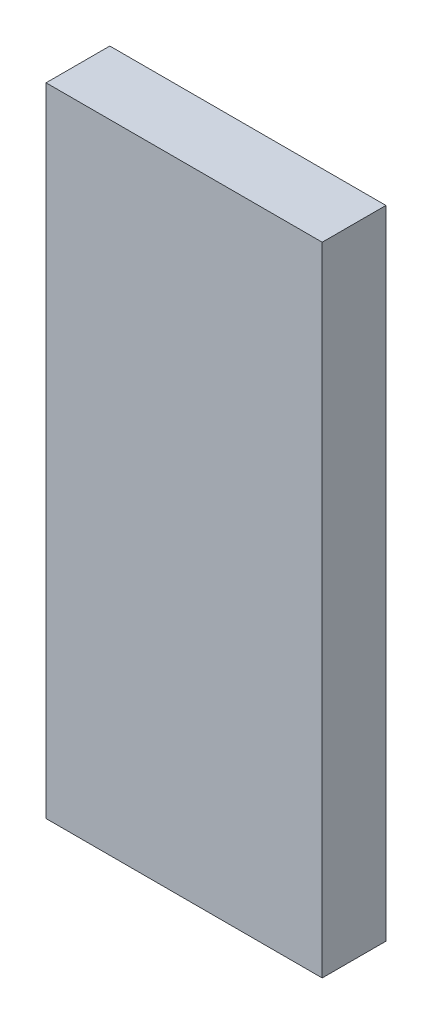
ISO-10303-21;
HEADER;
FILE_DESCRIPTION(('STEP AP214'),'2;1');
FILE_NAME('part.step','',(''),(''),'','','');
FILE_SCHEMA(('AUTOMOTIVE_DESIGN { 1 0 10303 214 1 1 1 1 }'));
ENDSEC;
DATA;
#1=APPLICATION_CONTEXT('core data for automotive mechanical design processes');
#2=APPLICATION_PROTOCOL_DEFINITION('international standard','automotive_design',2000,#1);
#3=PRODUCT_CONTEXT('',#1,'mechanical');
#4=PRODUCT('Part','Part','',(#3));
#5=PRODUCT_RELATED_PRODUCT_CATEGORY('part','',(#4));
#6=PRODUCT_DEFINITION_FORMATION('','',#4);
#7=PRODUCT_DEFINITION_CONTEXT('part definition',#1,'design');
#8=PRODUCT_DEFINITION('design','',#6,#7);
#9=PRODUCT_DEFINITION_SHAPE('','',#8);
#10=(LENGTH_UNIT() NAMED_UNIT(*) SI_UNIT(.MILLI.,.METRE.));
#11=(NAMED_UNIT(*) PLANE_ANGLE_UNIT() SI_UNIT($,.RADIAN.));
#12=(NAMED_UNIT(*) SI_UNIT($,.STERADIAN.) SOLID_ANGLE_UNIT());
#13=UNCERTAINTY_MEASURE_WITH_UNIT(LENGTH_MEASURE(1.E-05),#10,'distance_accuracy_value','');
#14=(GEOMETRIC_REPRESENTATION_CONTEXT(3) GLOBAL_UNCERTAINTY_ASSIGNED_CONTEXT((#13)) GLOBAL_UNIT_ASSIGNED_CONTEXT((#10,
#11,#12)) REPRESENTATION_CONTEXT('',''));
#15=CARTESIAN_POINT('',(0.,0.,0.));
#16=DIRECTION('',(0.,0.,1.));
#17=DIRECTION('',(1.,0.,0.));
#18=AXIS2_PLACEMENT_3D('',#15,#16,#17);
#19=CARTESIAN_POINT('',(0.,0.,0.));
#20=DIRECTION('',(0.,0.,1.));
#21=DIRECTION('',(1.,0.,0.));
#22=AXIS2_PLACEMENT_3D('',#19,#20,#21);
#23=PLANE('',#22);
#24=DIRECTION('',(0.,1.,0.));
#25=VECTOR('',#24,1.);
#26=CARTESIAN_POINT('',(-5.5,0.,0.));
#27=LINE('',#26,#25);
#28=CARTESIAN_POINT('',(-5.5,-14.,0.));
#29=VERTEX_POINT('',#28);
#30=CARTESIAN_POINT('',(-5.5,14.,0.));
#31=VERTEX_POINT('',#30);
#32=EDGE_CURVE('E125',#29,#31,#27,.T.);
#33=ORIENTED_EDGE('',*,*,#32,.T.);
#34=DIRECTION('',(1.,0.,0.));
#35=VECTOR('',#34,1.);
#36=CARTESIAN_POINT('',(6.5,14.,0.));
#37=LINE('',#36,#35);
#38=CARTESIAN_POINT('',(5.5,14.,0.));
#39=VERTEX_POINT('',#38);
#40=EDGE_CURVE('E127',#31,#39,#37,.T.);
#41=ORIENTED_EDGE('',*,*,#40,.T.);
#42=DIRECTION('',(0.,-1.,0.));
#43=VECTOR('',#42,1.);
#44=CARTESIAN_POINT('',(5.50000000000001,-15.,0.));
#45=LINE('',#44,#43);
#46=CARTESIAN_POINT('',(5.50000000000001,-14.,0.));
#47=VERTEX_POINT('',#46);
#48=EDGE_CURVE('E98',#39,#47,#45,.T.);
#49=ORIENTED_EDGE('',*,*,#48,.T.);
#50=DIRECTION('',(-1.,0.,0.));
#51=VECTOR('',#50,1.);
#52=CARTESIAN_POINT('',(0.,-14.,0.));
#53=LINE('',#52,#51);
#54=EDGE_CURVE('E123',#47,#29,#53,.T.);
#55=ORIENTED_EDGE('',*,*,#54,.T.);
#56=EDGE_LOOP('',(#33,#41,#49,#55));
#57=FACE_BOUND('',#56,.T.);
#58=CARTESIAN_POINT('',(0.,0.,0.));
#59=DIRECTION('',(0.,0.,1.));
#60=DIRECTION('',(1.,0.,0.));
#61=AXIS2_PLACEMENT_3D('',#58,#59,#60);
#62=CIRCLE('',#61,5.05);
#63=CARTESIAN_POINT('',(-5.05,0.,0.));
#64=VERTEX_POINT('',#63);
#65=EDGE_CURVE('E143',#64,#64,#62,.T.);
#66=ORIENTED_EDGE('',*,*,#65,.T.);
#67=EDGE_LOOP('',(#66));
#68=FACE_BOUND('',#67,.T.);
#69=ADVANCED_FACE('F33',(#57,#68),#23,.F.);
#70=CARTESIAN_POINT('',(6.5,0.,4.));
#71=DIRECTION('',(1.,0.,0.));
#72=DIRECTION('',(0.,1.,0.));
#73=AXIS2_PLACEMENT_3D('',#70,#71,#72);
#74=PLANE('',#73);
#75=DIRECTION('',(0.,0.,-1.));
#76=VECTOR('',#75,1.);
#77=CARTESIAN_POINT('',(6.5,-15.,4.));
#78=LINE('',#77,#76);
#79=CARTESIAN_POINT('',(6.5,-15.,4.));
#80=VERTEX_POINT('',#79);
#81=CARTESIAN_POINT('',(6.5,-15.,1.));
#82=VERTEX_POINT('',#81);
#83=EDGE_CURVE('E117',#80,#82,#78,.T.);
#84=ORIENTED_EDGE('',*,*,#83,.T.);
#85=DIRECTION('',(0.,1.,0.));
#86=VECTOR('',#85,1.);
#87=CARTESIAN_POINT('',(6.5,15.,1.));
#88=LINE('',#87,#86);
#89=CARTESIAN_POINT('',(6.5,15.,1.));
#90=VERTEX_POINT('',#89);
#91=EDGE_CURVE('E11',#82,#90,#88,.T.);
#92=ORIENTED_EDGE('',*,*,#91,.T.);
#93=DIRECTION('',(0.,0.,-1.));
#94=VECTOR('',#93,1.);
#95=CARTESIAN_POINT('',(6.5,15.,4.));
#96=LINE('',#95,#94);
#97=CARTESIAN_POINT('',(6.5,15.,4.));
#98=VERTEX_POINT('',#97);
#99=EDGE_CURVE('E89',#98,#90,#96,.T.);
#100=ORIENTED_EDGE('',*,*,#99,.F.);
#101=DIRECTION('',(0.,-1.,0.));
#102=VECTOR('',#101,1.);
#103=CARTESIAN_POINT('',(6.5,0.,4.));
#104=LINE('',#103,#102);
#105=EDGE_CURVE('E92',#98,#80,#104,.T.);
#106=ORIENTED_EDGE('',*,*,#105,.T.);
#107=EDGE_LOOP('',(#84,#92,#100,#106));
#108=FACE_BOUND('',#107,.T.);
#109=ADVANCED_FACE('F91',(#108),#74,.T.);
#110=CARTESIAN_POINT('',(0.,15.,4.));
#111=DIRECTION('',(0.,1.,0.));
#112=DIRECTION('',(0.,0.,1.));
#113=AXIS2_PLACEMENT_3D('',#110,#111,#112);
#114=PLANE('',#113);
#115=ORIENTED_EDGE('',*,*,#99,.T.);
#116=DIRECTION('',(-1.,0.,0.));
#117=VECTOR('',#116,1.);
#118=CARTESIAN_POINT('',(-6.5,15.,1.));
#119=LINE('',#118,#117);
#120=CARTESIAN_POINT('',(-6.5,15.,1.));
#121=VERTEX_POINT('',#120);
#122=EDGE_CURVE('E130',#90,#121,#119,.T.);
#123=ORIENTED_EDGE('',*,*,#122,.T.);
#124=DIRECTION('',(0.,0.,-1.));
#125=VECTOR('',#124,1.);
#126=CARTESIAN_POINT('',(-6.5,15.,4.));
#127=LINE('',#126,#125);
#128=CARTESIAN_POINT('',(-6.5,15.,4.));
#129=VERTEX_POINT('',#128);
#130=EDGE_CURVE('E99',#129,#121,#127,.T.);
#131=ORIENTED_EDGE('',*,*,#130,.F.);
#132=DIRECTION('',(1.,0.,0.));
#133=VECTOR('',#132,1.);
#134=CARTESIAN_POINT('',(0.,15.,4.));
#135=LINE('',#134,#133);
#136=EDGE_CURVE('E104',#129,#98,#135,.T.);
#137=ORIENTED_EDGE('',*,*,#136,.T.);
#138=EDGE_LOOP('',(#115,#123,#131,#137));
#139=FACE_BOUND('',#138,.T.);
#140=ADVANCED_FACE('F109',(#139),#114,.T.);
#141=CARTESIAN_POINT('',(-6.5,0.,4.));
#142=DIRECTION('',(1.,0.,0.));
#143=DIRECTION('',(0.,1.,0.));
#144=AXIS2_PLACEMENT_3D('',#141,#142,#143);
#145=PLANE('',#144);
#146=ORIENTED_EDGE('',*,*,#130,.T.);
#147=DIRECTION('',(0.,-1.,0.));
#148=VECTOR('',#147,1.);
#149=CARTESIAN_POINT('',(-6.5,0.,1.));
#150=LINE('',#149,#148);
#151=CARTESIAN_POINT('',(-6.5,-15.,1.));
#152=VERTEX_POINT('',#151);
#153=EDGE_CURVE('E57',#121,#152,#150,.T.);
#154=ORIENTED_EDGE('',*,*,#153,.T.);
#155=DIRECTION('',(0.,0.,-1.));
#156=VECTOR('',#155,1.);
#157=CARTESIAN_POINT('',(-6.5,-15.,4.));
#158=LINE('',#157,#156);
#159=CARTESIAN_POINT('',(-6.5,-15.,4.));
#160=VERTEX_POINT('',#159);
#161=EDGE_CURVE('E119',#160,#152,#158,.T.);
#162=ORIENTED_EDGE('',*,*,#161,.F.);
#163=DIRECTION('',(0.,-1.,0.));
#164=VECTOR('',#163,1.);
#165=CARTESIAN_POINT('',(-6.5,0.,4.));
#166=LINE('',#165,#164);
#167=EDGE_CURVE('E111',#129,#160,#166,.T.);
#168=ORIENTED_EDGE('',*,*,#167,.F.);
#169=EDGE_LOOP('',(#146,#154,#162,#168));
#170=FACE_BOUND('',#169,.T.);
#171=ADVANCED_FACE('F179',(#170),#145,.F.);
#172=CARTESIAN_POINT('',(0.,-15.,4.));
#173=DIRECTION('',(0.,1.,0.));
#174=DIRECTION('',(0.,0.,1.));
#175=AXIS2_PLACEMENT_3D('',#172,#173,#174);
#176=PLANE('',#175);
#177=ORIENTED_EDGE('',*,*,#161,.T.);
#178=DIRECTION('',(1.,0.,0.));
#179=VECTOR('',#178,1.);
#180=CARTESIAN_POINT('',(0.,-15.,1.));
#181=LINE('',#180,#179);
#182=EDGE_CURVE('E42',#152,#82,#181,.T.);
#183=ORIENTED_EDGE('',*,*,#182,.T.);
#184=ORIENTED_EDGE('',*,*,#83,.F.);
#185=DIRECTION('',(1.,0.,0.));
#186=VECTOR('',#185,1.);
#187=CARTESIAN_POINT('',(0.,-15.,4.));
#188=LINE('',#187,#186);
#189=EDGE_CURVE('E106',#160,#80,#188,.T.);
#190=ORIENTED_EDGE('',*,*,#189,.F.);
#191=EDGE_LOOP('',(#177,#183,#184,#190));
#192=FACE_BOUND('',#191,.T.);
#193=ADVANCED_FACE('F176',(#192),#176,.F.);
#194=CARTESIAN_POINT('',(0.,0.,4.));
#195=DIRECTION('',(0.,0.,1.));
#196=DIRECTION('',(1.,0.,0.));
#197=AXIS2_PLACEMENT_3D('',#194,#195,#196);
#198=PLANE('',#197);
#199=ORIENTED_EDGE('',*,*,#105,.F.);
#200=ORIENTED_EDGE('',*,*,#136,.F.);
#201=ORIENTED_EDGE('',*,*,#167,.T.);
#202=ORIENTED_EDGE('',*,*,#189,.T.);
#203=EDGE_LOOP('',(#199,#200,#201,#202));
#204=FACE_BOUND('',#203,.T.);
#205=ADVANCED_FACE('F103',(#204),#198,.T.);
#206=CARTESIAN_POINT('',(0.,0.,1.9));
#207=DIRECTION('',(0.,0.,-1.));
#208=DIRECTION('',(-1.,0.,0.));
#209=AXIS2_PLACEMENT_3D('',#206,#207,#208);
#210=CYLINDRICAL_SURFACE('',#209,5.05);
#211=CARTESIAN_POINT('',(0.,0.,1.9));
#212=DIRECTION('',(0.,0.,1.));
#213=DIRECTION('',(1.,0.,0.));
#214=AXIS2_PLACEMENT_3D('',#211,#212,#213);
#215=CIRCLE('',#214,5.05);
#216=CARTESIAN_POINT('',(-5.05,0.,1.9));
#217=VERTEX_POINT('',#216);
#218=EDGE_CURVE('E107',#217,#217,#215,.T.);
#219=CARTESIAN_POINT('',(-5.05,0.,1.9));
#220=CARTESIAN_POINT('',(-5.05,0.,1.88020833333333));
#221=CARTESIAN_POINT('',(-5.05,0.,1.86041666666667));
#222=CARTESIAN_POINT('',(-5.05,0.,1.82083333333333));
#223=CARTESIAN_POINT('',(-5.05,0.,1.80104166666667));
#224=CARTESIAN_POINT('',(-5.05,0.,1.76145833333333));
#225=CARTESIAN_POINT('',(-5.05,0.,1.74166666666667));
#226=CARTESIAN_POINT('',(-5.05,0.,1.70208333333333));
#227=CARTESIAN_POINT('',(-5.05,0.,1.68229166666667));
#228=CARTESIAN_POINT('',(-5.05,0.,1.64270833333333));
#229=CARTESIAN_POINT('',(-5.05,0.,1.62291666666667));
#230=CARTESIAN_POINT('',(-5.05,0.,1.58333333333333));
#231=CARTESIAN_POINT('',(-5.05,0.,1.56354166666667));
#232=CARTESIAN_POINT('',(-5.05,0.,1.52395833333333));
#233=CARTESIAN_POINT('',(-5.05,0.,1.50416666666667));
#234=CARTESIAN_POINT('',(-5.05,0.,1.46458333333333));
#235=CARTESIAN_POINT('',(-5.05,0.,1.44479166666667));
#236=CARTESIAN_POINT('',(-5.05,0.,1.40520833333333));
#237=CARTESIAN_POINT('',(-5.05,0.,1.38541666666667));
#238=CARTESIAN_POINT('',(-5.05,0.,1.34583333333333));
#239=CARTESIAN_POINT('',(-5.05,0.,1.32604166666667));
#240=CARTESIAN_POINT('',(-5.05,0.,1.28645833333333));
#241=CARTESIAN_POINT('',(-5.05,0.,1.26666666666667));
#242=CARTESIAN_POINT('',(-5.05,0.,1.22708333333333));
#243=CARTESIAN_POINT('',(-5.05,0.,1.20729166666667));
#244=CARTESIAN_POINT('',(-5.05,0.,1.16770833333333));
#245=CARTESIAN_POINT('',(-5.05,0.,1.14791666666667));
#246=CARTESIAN_POINT('',(-5.05,0.,1.10833333333333));
#247=CARTESIAN_POINT('',(-5.05,0.,1.08854166666667));
#248=CARTESIAN_POINT('',(-5.05,0.,1.04895833333333));
#249=CARTESIAN_POINT('',(-5.05,0.,1.02916666666667));
#250=CARTESIAN_POINT('',(-5.05,0.,0.989583333333333));
#251=CARTESIAN_POINT('',(-5.05,0.,0.969791666666667));
#252=CARTESIAN_POINT('',(-5.05,0.,0.930208333333333));
#253=CARTESIAN_POINT('',(-5.05,0.,0.910416666666667));
#254=CARTESIAN_POINT('',(-5.05,0.,0.870833333333333));
#255=CARTESIAN_POINT('',(-5.05,0.,0.851041666666667));
#256=CARTESIAN_POINT('',(-5.05,0.,0.811458333333333));
#257=CARTESIAN_POINT('',(-5.05,0.,0.791666666666667));
#258=CARTESIAN_POINT('',(-5.05,0.,0.752083333333333));
#259=CARTESIAN_POINT('',(-5.05,0.,0.732291666666667));
#260=CARTESIAN_POINT('',(-5.05,0.,0.692708333333333));
#261=CARTESIAN_POINT('',(-5.05,0.,0.672916666666667));
#262=CARTESIAN_POINT('',(-5.05,0.,0.633333333333333));
#263=CARTESIAN_POINT('',(-5.05,0.,0.613541666666667));
#264=CARTESIAN_POINT('',(-5.05,0.,0.573958333333333));
#265=CARTESIAN_POINT('',(-5.05,0.,0.554166666666667));
#266=CARTESIAN_POINT('',(-5.05,0.,0.514583333333333));
#267=CARTESIAN_POINT('',(-5.05,0.,0.494791666666667));
#268=CARTESIAN_POINT('',(-5.05,0.,0.455208333333333));
#269=CARTESIAN_POINT('',(-5.05,0.,0.435416666666667));
#270=CARTESIAN_POINT('',(-5.05,0.,0.395833333333333));
#271=CARTESIAN_POINT('',(-5.05,0.,0.376041666666667));
#272=CARTESIAN_POINT('',(-5.05,0.,0.336458333333333));
#273=CARTESIAN_POINT('',(-5.05,0.,0.316666666666667));
#274=CARTESIAN_POINT('',(-5.05,0.,0.277083333333333));
#275=CARTESIAN_POINT('',(-5.05,0.,0.257291666666667));
#276=CARTESIAN_POINT('',(-5.05,0.,0.217708333333333));
#277=CARTESIAN_POINT('',(-5.05,0.,0.197916666666667));
#278=CARTESIAN_POINT('',(-5.05,0.,0.158333333333333));
#279=CARTESIAN_POINT('',(-5.05,0.,0.138541666666667));
#280=CARTESIAN_POINT('',(-5.05,0.,0.0989583333333333));
#281=CARTESIAN_POINT('',(-5.05,0.,0.0791666666666666));
#282=CARTESIAN_POINT('',(-5.05,0.,0.0395833333333333));
#283=CARTESIAN_POINT('',(-5.05,0.,0.0197916666666666));
#284=CARTESIAN_POINT('',(-5.05,0.,0.));
#285=B_SPLINE_CURVE_WITH_KNOTS('',3,(#219,#220,#221,#222,#223,#224,#225,#226,#227,#228,#229,
#230,#231,#232,#233,#234,#235,#236,#237,#238,#239,#240,#241,#242,#243,#244,#245,#246,#247,#248,
#249,#250,#251,#252,#253,#254,#255,#256,#257,#258,#259,#260,#261,#262,#263,#264,#265,#266,#267,
#268,#269,#270,#271,#272,#273,#274,#275,#276,#277,#278,#279,#280,#281,#282,#283,#284),
.UNSPECIFIED.,.F.,.F.,(4,2,2,2,2,2,2,2,2,2,2,2,2,2,2,2,2,2,2,2,2,2,2,2,2,2,2,2,2,2,2,2,4),(0.,
0.059375,0.11875,0.178125,0.2375,0.296875,0.35625,0.415625,0.475,0.534375,0.59375,0.653125,
0.7125,0.771875,0.83125,0.890625,0.95,1.009375,1.06875,1.128125,1.1875,1.246875,1.30625,
1.365625,1.425,1.484375,1.54375,1.603125,1.6625,1.721875,1.78125,1.840625,1.9),.UNSPECIFIED.);
#286=EDGE_CURVE('BSEAM154',#217,#64,#285,.T.);
#287=ORIENTED_EDGE('',*,*,#218,.T.);
#288=ORIENTED_EDGE('',*,*,#65,.F.);
#289=ORIENTED_EDGE('',*,*,#286,.T.);
#290=ORIENTED_EDGE('',*,*,#286,.F.);
#291=EDGE_LOOP('',(#287,#289,#288,#290));
#292=FACE_BOUND('',#291,.T.);
#293=ADVANCED_FACE('F154',(#292),#210,.F.);
#294=CARTESIAN_POINT('',(0.,0.,1.9));
#295=DIRECTION('',(0.,0.,1.));
#296=DIRECTION('',(1.,0.,0.));
#297=AXIS2_PLACEMENT_3D('',#294,#295,#296);
#298=PLANE('',#297);
#299=ORIENTED_EDGE('',*,*,#218,.F.);
#300=EDGE_LOOP('',(#299));
#301=FACE_BOUND('',#300,.T.);
#302=ADVANCED_FACE('F157',(#301),#298,.F.);
#303=CARTESIAN_POINT('',(0.,-15.,1.));
#304=DIRECTION('',(0.,0.707106781186549,0.707106781186546));
#305=DIRECTION('',(1.,0.,0.));
#306=AXIS2_PLACEMENT_3D('',#303,#304,#305);
#307=PLANE('',#306);
#308=DIRECTION('',(0.577350269189625,-0.577350269189625,0.577350269189627));
#309=VECTOR('',#308,1.);
#310=CARTESIAN_POINT('',(0.833333333333346,-9.33333333333335,-4.66666666666667));
#311=LINE('',#310,#309);
#312=EDGE_CURVE('E137',#82,#47,#311,.F.);
#313=ORIENTED_EDGE('',*,*,#312,.F.);
#314=ORIENTED_EDGE('',*,*,#182,.F.);
#315=DIRECTION('',(0.577350269189625,0.577350269189625,-0.577350269189627));
#316=VECTOR('',#315,1.);
#317=CARTESIAN_POINT('',(-4.33333333333334,-12.8333333333333,-1.16666666666667));
#318=LINE('',#317,#316);
#319=EDGE_CURVE('E37',#29,#152,#318,.F.);
#320=ORIENTED_EDGE('',*,*,#319,.F.);
#321=ORIENTED_EDGE('',*,*,#54,.F.);
#322=EDGE_LOOP('',(#313,#314,#320,#321));
#323=FACE_BOUND('',#322,.T.);
#324=ADVANCED_FACE('F35',(#323),#307,.F.);
#325=CARTESIAN_POINT('',(-6.5,0.,1.));
#326=DIRECTION('',(0.707106781186549,0.,0.707106781186546));
#327=DIRECTION('',(0.,-1.,0.));
#328=AXIS2_PLACEMENT_3D('',#325,#326,#327);
#329=PLANE('',#328);
#330=ORIENTED_EDGE('',*,*,#319,.T.);
#331=ORIENTED_EDGE('',*,*,#153,.F.);
#332=DIRECTION('',(-0.577350269189625,0.577350269189625,0.577350269189627));
#333=VECTOR('',#332,1.);
#334=CARTESIAN_POINT('',(-1.50000000000001,10.,-4.00000000000001));
#335=LINE('',#334,#333);
#336=EDGE_CURVE('E136',#31,#121,#335,.T.);
#337=ORIENTED_EDGE('',*,*,#336,.F.);
#338=ORIENTED_EDGE('',*,*,#32,.F.);
#339=EDGE_LOOP('',(#330,#331,#337,#338));
#340=FACE_BOUND('',#339,.T.);
#341=ADVANCED_FACE('F164',(#340),#329,.F.);
#342=CARTESIAN_POINT('',(5.5,0.,0.));
#343=DIRECTION('',(0.707106781186549,0.,-0.707106781186546));
#344=DIRECTION('',(0.,1.,0.));
#345=AXIS2_PLACEMENT_3D('',#342,#343,#344);
#346=PLANE('',#345);
#347=ORIENTED_EDGE('',*,*,#312,.T.);
#348=ORIENTED_EDGE('',*,*,#48,.F.);
#349=DIRECTION('',(0.577350269189625,0.577350269189625,0.577350269189627));
#350=VECTOR('',#349,1.);
#351=CARTESIAN_POINT('',(0.833333333333346,9.33333333333334,-4.66666666666667));
#352=LINE('',#351,#350);
#353=EDGE_CURVE('E134',#90,#39,#352,.F.);
#354=ORIENTED_EDGE('',*,*,#353,.F.);
#355=ORIENTED_EDGE('',*,*,#91,.F.);
#356=EDGE_LOOP('',(#347,#348,#354,#355));
#357=FACE_BOUND('',#356,.T.);
#358=ADVANCED_FACE('F187',(#357),#346,.T.);
#359=CARTESIAN_POINT('',(0.,14.,0.));
#360=DIRECTION('',(0.,0.707106781186549,-0.707106781186546));
#361=DIRECTION('',(-1.,0.,0.));
#362=AXIS2_PLACEMENT_3D('',#359,#360,#361);
#363=PLANE('',#362);
#364=ORIENTED_EDGE('',*,*,#336,.T.);
#365=ORIENTED_EDGE('',*,*,#122,.F.);
#366=ORIENTED_EDGE('',*,*,#353,.T.);
#367=ORIENTED_EDGE('',*,*,#40,.F.);
#368=EDGE_LOOP('',(#364,#365,#366,#367));
#369=FACE_BOUND('',#368,.T.);
#370=ADVANCED_FACE('F184',(#369),#363,.T.);
#371=CLOSED_SHELL('',(#69,#109,#140,#171,#193,#205,#293,#302,#324,#341,#358,#370));
#372=MANIFOLD_SOLID_BREP('B2',#371);
#373=ADVANCED_BREP_SHAPE_REPRESENTATION('',(#18,#372),#14);
#374=SHAPE_DEFINITION_REPRESENTATION(#9,#373);
ENDSEC;
END-ISO-10303-21;
